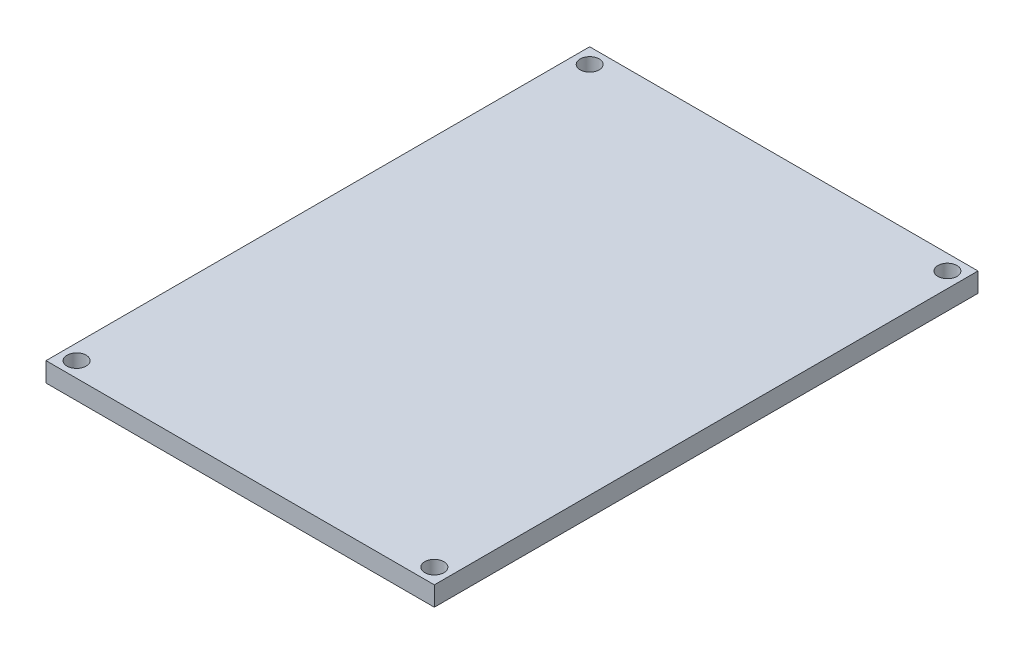
ISO-10303-21;
HEADER;
FILE_DESCRIPTION(('STEP AP214'),'2;1');
FILE_NAME('part.step','',(''),(''),'','','');
FILE_SCHEMA(('AUTOMOTIVE_DESIGN { 1 0 10303 214 1 1 1 1 }'));
ENDSEC;
DATA;
#1=APPLICATION_CONTEXT('core data for automotive mechanical design processes');
#2=APPLICATION_PROTOCOL_DEFINITION('international standard','automotive_design',2000,#1);
#3=PRODUCT_CONTEXT('',#1,'mechanical');
#4=PRODUCT('Part','Part','',(#3));
#5=PRODUCT_RELATED_PRODUCT_CATEGORY('part','',(#4));
#6=PRODUCT_DEFINITION_FORMATION('','',#4);
#7=PRODUCT_DEFINITION_CONTEXT('part definition',#1,'design');
#8=PRODUCT_DEFINITION('design','',#6,#7);
#9=PRODUCT_DEFINITION_SHAPE('','',#8);
#10=(LENGTH_UNIT() NAMED_UNIT(*) SI_UNIT(.MILLI.,.METRE.));
#11=(NAMED_UNIT(*) PLANE_ANGLE_UNIT() SI_UNIT($,.RADIAN.));
#12=(NAMED_UNIT(*) SI_UNIT($,.STERADIAN.) SOLID_ANGLE_UNIT());
#13=UNCERTAINTY_MEASURE_WITH_UNIT(LENGTH_MEASURE(1.E-05),#10,'distance_accuracy_value','');
#14=(GEOMETRIC_REPRESENTATION_CONTEXT(3) GLOBAL_UNCERTAINTY_ASSIGNED_CONTEXT((#13)) GLOBAL_UNIT_ASSIGNED_CONTEXT((#10,
#11,#12)) REPRESENTATION_CONTEXT('',''));
#15=CARTESIAN_POINT('',(0.,0.,0.));
#16=DIRECTION('',(0.,0.,1.));
#17=DIRECTION('',(1.,0.,0.));
#18=AXIS2_PLACEMENT_3D('',#15,#16,#17);
#19=CARTESIAN_POINT('',(-43.7578595458525,2.54,-27.0487963841083));
#20=DIRECTION('',(1.,0.,0.));
#21=DIRECTION('',(0.,0.,-1.));
#22=AXIS2_PLACEMENT_3D('',#19,#20,#21);
#23=PLANE('',#22);
#24=DIRECTION('',(0.,0.,1.));
#25=VECTOR('',#24,1.);
#26=CARTESIAN_POINT('',(-43.7578595458525,0.,-27.0487963841083));
#27=LINE('',#26,#25);
#28=CARTESIAN_POINT('',(-43.7578595458525,0.,-27.0487963841083));
#29=VERTEX_POINT('',#28);
#30=CARTESIAN_POINT('',(-43.7578595458525,0.,44.0712036158917));
#31=VERTEX_POINT('',#30);
#32=EDGE_CURVE('E100',#29,#31,#27,.T.);
#33=ORIENTED_EDGE('',*,*,#32,.T.);
#34=DIRECTION('',(0.,-1.,0.));
#35=VECTOR('',#34,1.);
#36=CARTESIAN_POINT('',(-43.7578595458525,2.54,44.0712036158917));
#37=LINE('',#36,#35);
#38=CARTESIAN_POINT('',(-43.7578595458525,2.54,44.0712036158917));
#39=VERTEX_POINT('',#38);
#40=EDGE_CURVE('E11',#39,#31,#37,.T.);
#41=ORIENTED_EDGE('',*,*,#40,.F.);
#42=DIRECTION('',(0.,0.,1.));
#43=VECTOR('',#42,1.);
#44=CARTESIAN_POINT('',(-43.7578595458525,2.54,-27.0487963841083));
#45=LINE('',#44,#43);
#46=CARTESIAN_POINT('',(-43.7578595458525,2.54,-27.0487963841083));
#47=VERTEX_POINT('',#46);
#48=EDGE_CURVE('E88',#47,#39,#45,.T.);
#49=ORIENTED_EDGE('',*,*,#48,.F.);
#50=DIRECTION('',(0.,-1.,0.));
#51=VECTOR('',#50,1.);
#52=CARTESIAN_POINT('',(-43.7578595458525,2.54,-27.0487963841083));
#53=LINE('',#52,#51);
#54=EDGE_CURVE('E96',#47,#29,#53,.T.);
#55=ORIENTED_EDGE('',*,*,#54,.T.);
#56=EDGE_LOOP('',(#33,#41,#49,#55));
#57=FACE_BOUND('',#56,.T.);
#58=ADVANCED_FACE('F37',(#57),#23,.F.);
#59=CARTESIAN_POINT('',(-43.7578595458525,2.54,44.0712036158917));
#60=DIRECTION('',(0.,0.,-1.));
#61=DIRECTION('',(-1.,0.,0.));
#62=AXIS2_PLACEMENT_3D('',#59,#60,#61);
#63=PLANE('',#62);
#64=DIRECTION('',(1.,0.,0.));
#65=VECTOR('',#64,1.);
#66=CARTESIAN_POINT('',(-43.7578595458525,0.,44.0712036158917));
#67=LINE('',#66,#65);
#68=CARTESIAN_POINT('',(7.04214045414754,0.,44.0712036158917));
#69=VERTEX_POINT('',#68);
#70=EDGE_CURVE('E92',#31,#69,#67,.T.);
#71=ORIENTED_EDGE('',*,*,#70,.T.);
#72=DIRECTION('',(0.,-1.,0.));
#73=VECTOR('',#72,1.);
#74=CARTESIAN_POINT('',(7.04214045414754,2.54,44.0712036158917));
#75=LINE('',#74,#73);
#76=CARTESIAN_POINT('',(7.04214045414754,2.54,44.0712036158917));
#77=VERTEX_POINT('',#76);
#78=EDGE_CURVE('E45',#77,#69,#75,.T.);
#79=ORIENTED_EDGE('',*,*,#78,.F.);
#80=DIRECTION('',(1.,0.,0.));
#81=VECTOR('',#80,1.);
#82=CARTESIAN_POINT('',(-43.7578595458525,2.54,44.0712036158917));
#83=LINE('',#82,#81);
#84=EDGE_CURVE('E83',#39,#77,#83,.T.);
#85=ORIENTED_EDGE('',*,*,#84,.F.);
#86=ORIENTED_EDGE('',*,*,#40,.T.);
#87=EDGE_LOOP('',(#71,#79,#85,#86));
#88=FACE_BOUND('',#87,.T.);
#89=ADVANCED_FACE('F91',(#88),#63,.F.);
#90=CARTESIAN_POINT('',(7.04214045414754,2.54,-27.0487963841083));
#91=DIRECTION('',(-1.,0.,0.));
#92=DIRECTION('',(0.,0.,1.));
#93=AXIS2_PLACEMENT_3D('',#90,#91,#92);
#94=PLANE('',#93);
#95=DIRECTION('',(0.,0.,-1.));
#96=VECTOR('',#95,1.);
#97=CARTESIAN_POINT('',(7.04214045414754,0.,-27.0487963841083));
#98=LINE('',#97,#96);
#99=CARTESIAN_POINT('',(7.04214045414754,0.,-27.0487963841083));
#100=VERTEX_POINT('',#99);
#101=EDGE_CURVE('E70',#69,#100,#98,.T.);
#102=ORIENTED_EDGE('',*,*,#101,.T.);
#103=DIRECTION('',(0.,-1.,0.));
#104=VECTOR('',#103,1.);
#105=CARTESIAN_POINT('',(7.04214045414754,2.54,-27.0487963841083));
#106=LINE('',#105,#104);
#107=CARTESIAN_POINT('',(7.04214045414754,2.54,-27.0487963841083));
#108=VERTEX_POINT('',#107);
#109=EDGE_CURVE('E93',#108,#100,#106,.T.);
#110=ORIENTED_EDGE('',*,*,#109,.F.);
#111=DIRECTION('',(0.,0.,-1.));
#112=VECTOR('',#111,1.);
#113=CARTESIAN_POINT('',(7.04214045414754,2.54,-27.0487963841083));
#114=LINE('',#113,#112);
#115=EDGE_CURVE('E86',#77,#108,#114,.T.);
#116=ORIENTED_EDGE('',*,*,#115,.F.);
#117=ORIENTED_EDGE('',*,*,#78,.T.);
#118=EDGE_LOOP('',(#102,#110,#116,#117));
#119=FACE_BOUND('',#118,.T.);
#120=ADVANCED_FACE('F94',(#119),#94,.F.);
#121=CARTESIAN_POINT('',(-43.7578595458525,2.54,-27.0487963841083));
#122=DIRECTION('',(0.,0.,1.));
#123=DIRECTION('',(1.,0.,0.));
#124=AXIS2_PLACEMENT_3D('',#121,#122,#123);
#125=PLANE('',#124);
#126=DIRECTION('',(-1.,0.,0.));
#127=VECTOR('',#126,1.);
#128=CARTESIAN_POINT('',(-43.7578595458525,0.,-27.0487963841083));
#129=LINE('',#128,#127);
#130=EDGE_CURVE('E76',#100,#29,#129,.T.);
#131=ORIENTED_EDGE('',*,*,#130,.T.);
#132=ORIENTED_EDGE('',*,*,#54,.F.);
#133=DIRECTION('',(-1.,0.,0.));
#134=VECTOR('',#133,1.);
#135=CARTESIAN_POINT('',(-43.7578595458525,2.54,-27.0487963841083));
#136=LINE('',#135,#134);
#137=EDGE_CURVE('E53',#108,#47,#136,.T.);
#138=ORIENTED_EDGE('',*,*,#137,.F.);
#139=ORIENTED_EDGE('',*,*,#109,.T.);
#140=EDGE_LOOP('',(#131,#132,#138,#139));
#141=FACE_BOUND('',#140,.T.);
#142=ADVANCED_FACE('F108',(#141),#125,.F.);
#143=CARTESIAN_POINT('',(0.,2.54,0.));
#144=DIRECTION('',(0.,1.,0.));
#145=DIRECTION('',(0.,0.,1.));
#146=AXIS2_PLACEMENT_3D('',#143,#144,#145);
#147=PLANE('',#146);
#148=CARTESIAN_POINT('',(5.04214045414754,2.54,-25.0487963841083));
#149=DIRECTION('',(0.,1.,0.));
#150=DIRECTION('',(0.,0.,1.));
#151=AXIS2_PLACEMENT_3D('',#148,#149,#150);
#152=CIRCLE('',#151,1.24652393260014);
#153=CARTESIAN_POINT('',(5.04214045414754,2.54,-23.8022724515081));
#154=VERTEX_POINT('',#153);
#155=EDGE_CURVE('E127',#154,#154,#152,.T.);
#156=ORIENTED_EDGE('',*,*,#155,.F.);
#157=EDGE_LOOP('',(#156));
#158=FACE_BOUND('',#157,.T.);
#159=CARTESIAN_POINT('',(-41.7578595458525,2.54,42.0712036158917));
#160=DIRECTION('',(0.,1.,0.));
#161=DIRECTION('',(0.,0.,1.));
#162=AXIS2_PLACEMENT_3D('',#159,#160,#161);
#163=CIRCLE('',#162,1.24870355405787);
#164=CARTESIAN_POINT('',(-41.7578595458525,2.54,43.3199071699496));
#165=VERTEX_POINT('',#164);
#166=EDGE_CURVE('E120',#165,#165,#163,.T.);
#167=ORIENTED_EDGE('',*,*,#166,.F.);
#168=EDGE_LOOP('',(#167));
#169=FACE_BOUND('',#168,.T.);
#170=CARTESIAN_POINT('',(5.04214045414754,2.54,42.0712036158917));
#171=DIRECTION('',(0.,1.,0.));
#172=DIRECTION('',(0.,0.,1.));
#173=AXIS2_PLACEMENT_3D('',#170,#171,#172);
#174=CIRCLE('',#173,1.25193443562676);
#175=CARTESIAN_POINT('',(5.04214045414754,2.54,43.3231380515185));
#176=VERTEX_POINT('',#175);
#177=EDGE_CURVE('E132',#176,#176,#174,.T.);
#178=ORIENTED_EDGE('',*,*,#177,.F.);
#179=EDGE_LOOP('',(#178));
#180=FACE_BOUND('',#179,.T.);
#181=CARTESIAN_POINT('',(-41.7578595458525,2.54,-25.0487963841083));
#182=DIRECTION('',(0.,1.,0.));
#183=DIRECTION('',(0.,0.,1.));
#184=AXIS2_PLACEMENT_3D('',#181,#182,#183);
#185=CIRCLE('',#184,1.24558138661633);
#186=CARTESIAN_POINT('',(-41.7578595458525,2.54,-23.8032149974919));
#187=VERTEX_POINT('',#186);
#188=EDGE_CURVE('E114',#187,#187,#185,.T.);
#189=ORIENTED_EDGE('',*,*,#188,.F.);
#190=EDGE_LOOP('',(#189));
#191=FACE_BOUND('',#190,.T.);
#192=ORIENTED_EDGE('',*,*,#48,.T.);
#193=ORIENTED_EDGE('',*,*,#84,.T.);
#194=ORIENTED_EDGE('',*,*,#115,.T.);
#195=ORIENTED_EDGE('',*,*,#137,.T.);
#196=EDGE_LOOP('',(#192,#193,#194,#195));
#197=FACE_BOUND('',#196,.T.);
#198=ADVANCED_FACE('F84',(#158,#169,#180,#191,#197),#147,.T.);
#199=CARTESIAN_POINT('',(0.,0.,0.));
#200=DIRECTION('',(0.,1.,0.));
#201=DIRECTION('',(0.,0.,1.));
#202=AXIS2_PLACEMENT_3D('',#199,#200,#201);
#203=PLANE('',#202);
#204=CARTESIAN_POINT('',(5.04214045414754,0.,-25.0487963841083));
#205=DIRECTION('',(0.,1.,0.));
#206=DIRECTION('',(0.,0.,1.));
#207=AXIS2_PLACEMENT_3D('',#204,#205,#206);
#208=CIRCLE('',#207,1.24652393260014);
#209=CARTESIAN_POINT('',(5.04214045414754,0.,-23.8022724515081));
#210=VERTEX_POINT('',#209);
#211=EDGE_CURVE('E117',#210,#210,#208,.T.);
#212=ORIENTED_EDGE('',*,*,#211,.T.);
#213=EDGE_LOOP('',(#212));
#214=FACE_BOUND('',#213,.T.);
#215=CARTESIAN_POINT('',(-41.7578595458525,0.,42.0712036158917));
#216=DIRECTION('',(0.,1.,0.));
#217=DIRECTION('',(0.,0.,1.));
#218=AXIS2_PLACEMENT_3D('',#215,#216,#217);
#219=CIRCLE('',#218,1.24870355405787);
#220=CARTESIAN_POINT('',(-41.7578595458525,0.,43.3199071699496));
#221=VERTEX_POINT('',#220);
#222=EDGE_CURVE('E123',#221,#221,#219,.T.);
#223=ORIENTED_EDGE('',*,*,#222,.T.);
#224=EDGE_LOOP('',(#223));
#225=FACE_BOUND('',#224,.T.);
#226=CARTESIAN_POINT('',(5.04214045414754,0.,42.0712036158917));
#227=DIRECTION('',(0.,1.,0.));
#228=DIRECTION('',(0.,0.,1.));
#229=AXIS2_PLACEMENT_3D('',#226,#227,#228);
#230=CIRCLE('',#229,1.25193443562676);
#231=CARTESIAN_POINT('',(5.04214045414754,0.,43.3231380515185));
#232=VERTEX_POINT('',#231);
#233=EDGE_CURVE('E124',#232,#232,#230,.T.);
#234=ORIENTED_EDGE('',*,*,#233,.T.);
#235=EDGE_LOOP('',(#234));
#236=FACE_BOUND('',#235,.T.);
#237=CARTESIAN_POINT('',(-41.7578595458525,0.,-25.0487963841083));
#238=DIRECTION('',(0.,1.,0.));
#239=DIRECTION('',(0.,0.,1.));
#240=AXIS2_PLACEMENT_3D('',#237,#238,#239);
#241=CIRCLE('',#240,1.24558138661633);
#242=CARTESIAN_POINT('',(-41.7578595458525,0.,-23.8032149974919));
#243=VERTEX_POINT('',#242);
#244=EDGE_CURVE('E103',#243,#243,#241,.T.);
#245=ORIENTED_EDGE('',*,*,#244,.T.);
#246=EDGE_LOOP('',(#245));
#247=FACE_BOUND('',#246,.T.);
#248=ORIENTED_EDGE('',*,*,#32,.F.);
#249=ORIENTED_EDGE('',*,*,#130,.F.);
#250=ORIENTED_EDGE('',*,*,#101,.F.);
#251=ORIENTED_EDGE('',*,*,#70,.F.);
#252=EDGE_LOOP('',(#248,#249,#250,#251));
#253=FACE_BOUND('',#252,.T.);
#254=ADVANCED_FACE('F111',(#214,#225,#236,#247,#253),#203,.F.);
#255=CARTESIAN_POINT('',(-41.7578595458525,0.,-25.0487963841083));
#256=DIRECTION('',(0.,1.,0.));
#257=DIRECTION('',(0.,0.,1.));
#258=AXIS2_PLACEMENT_3D('',#255,#256,#257);
#259=CYLINDRICAL_SURFACE('',#258,1.24558138661633);
#260=ORIENTED_EDGE('',*,*,#244,.F.);
#261=EDGE_LOOP('',(#260));
#262=FACE_BOUND('',#261,.T.);
#263=ORIENTED_EDGE('',*,*,#188,.T.);
#264=EDGE_LOOP('',(#263));
#265=FACE_BOUND('',#264,.T.);
#266=ADVANCED_FACE('F144',(#262,#265),#259,.F.);
#267=CARTESIAN_POINT('',(5.04214045414754,0.,42.0712036158917));
#268=DIRECTION('',(0.,1.,0.));
#269=DIRECTION('',(0.,0.,1.));
#270=AXIS2_PLACEMENT_3D('',#267,#268,#269);
#271=CYLINDRICAL_SURFACE('',#270,1.25193443562676);
#272=ORIENTED_EDGE('',*,*,#233,.F.);
#273=EDGE_LOOP('',(#272));
#274=FACE_BOUND('',#273,.T.);
#275=ORIENTED_EDGE('',*,*,#177,.T.);
#276=EDGE_LOOP('',(#275));
#277=FACE_BOUND('',#276,.T.);
#278=ADVANCED_FACE('F140',(#274,#277),#271,.F.);
#279=CARTESIAN_POINT('',(-41.7578595458525,0.,42.0712036158917));
#280=DIRECTION('',(0.,1.,0.));
#281=DIRECTION('',(0.,0.,1.));
#282=AXIS2_PLACEMENT_3D('',#279,#280,#281);
#283=CYLINDRICAL_SURFACE('',#282,1.24870355405787);
#284=ORIENTED_EDGE('',*,*,#222,.F.);
#285=EDGE_LOOP('',(#284));
#286=FACE_BOUND('',#285,.T.);
#287=ORIENTED_EDGE('',*,*,#166,.T.);
#288=EDGE_LOOP('',(#287));
#289=FACE_BOUND('',#288,.T.);
#290=ADVANCED_FACE('F143',(#286,#289),#283,.F.);
#291=CARTESIAN_POINT('',(5.04214045414754,0.,-25.0487963841083));
#292=DIRECTION('',(0.,1.,0.));
#293=DIRECTION('',(0.,0.,1.));
#294=AXIS2_PLACEMENT_3D('',#291,#292,#293);
#295=CYLINDRICAL_SURFACE('',#294,1.24652393260014);
#296=ORIENTED_EDGE('',*,*,#211,.F.);
#297=EDGE_LOOP('',(#296));
#298=FACE_BOUND('',#297,.T.);
#299=ORIENTED_EDGE('',*,*,#155,.T.);
#300=EDGE_LOOP('',(#299));
#301=FACE_BOUND('',#300,.T.);
#302=ADVANCED_FACE('F205',(#298,#301),#295,.F.);
#303=CLOSED_SHELL('',(#58,#89,#120,#142,#198,#254,#266,#278,#290,#302));
#304=MANIFOLD_SOLID_BREP('B2',#303);
#305=ADVANCED_BREP_SHAPE_REPRESENTATION('',(#18,#304),#14);
#306=SHAPE_DEFINITION_REPRESENTATION(#9,#305);
ENDSEC;
END-ISO-10303-21;
